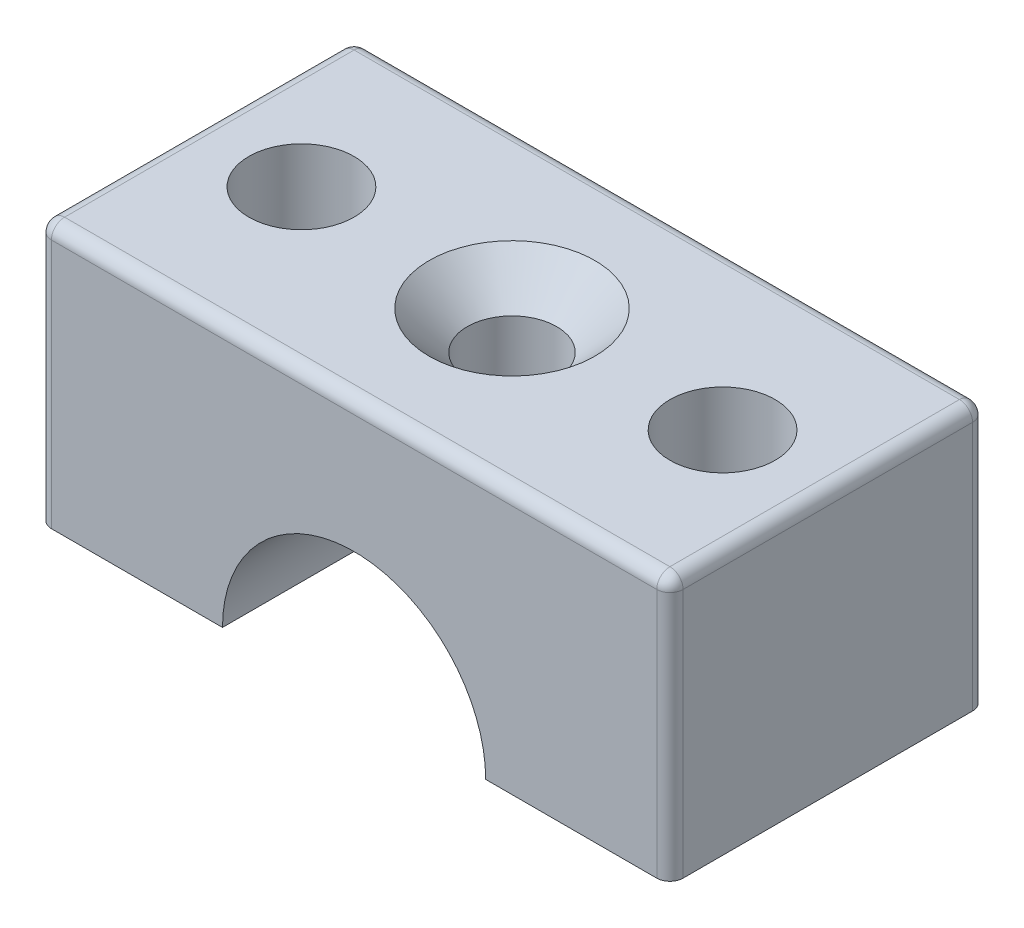
ISO-10303-21;
HEADER;
FILE_DESCRIPTION(('STEP AP214'),'2;1');
FILE_NAME('part.step','',(''),(''),'','','');
FILE_SCHEMA(('AUTOMOTIVE_DESIGN { 1 0 10303 214 1 1 1 1 }'));
ENDSEC;
DATA;
#1=APPLICATION_CONTEXT('core data for automotive mechanical design processes');
#2=APPLICATION_PROTOCOL_DEFINITION('international standard','automotive_design',2000,#1);
#3=PRODUCT_CONTEXT('',#1,'mechanical');
#4=PRODUCT('Part','Part','',(#3));
#5=PRODUCT_RELATED_PRODUCT_CATEGORY('part','',(#4));
#6=PRODUCT_DEFINITION_FORMATION('','',#4);
#7=PRODUCT_DEFINITION_CONTEXT('part definition',#1,'design');
#8=PRODUCT_DEFINITION('design','',#6,#7);
#9=PRODUCT_DEFINITION_SHAPE('','',#8);
#10=(LENGTH_UNIT() NAMED_UNIT(*) SI_UNIT(.MILLI.,.METRE.));
#11=(NAMED_UNIT(*) PLANE_ANGLE_UNIT() SI_UNIT($,.RADIAN.));
#12=(NAMED_UNIT(*) SI_UNIT($,.STERADIAN.) SOLID_ANGLE_UNIT());
#13=UNCERTAINTY_MEASURE_WITH_UNIT(LENGTH_MEASURE(1.E-05),#10,'distance_accuracy_value','');
#14=(GEOMETRIC_REPRESENTATION_CONTEXT(3) GLOBAL_UNCERTAINTY_ASSIGNED_CONTEXT((#13)) GLOBAL_UNIT_ASSIGNED_CONTEXT((#10,
#11,#12)) REPRESENTATION_CONTEXT('',''));
#15=CARTESIAN_POINT('',(0.,0.,0.));
#16=DIRECTION('',(0.,0.,1.));
#17=DIRECTION('',(1.,0.,0.));
#18=AXIS2_PLACEMENT_3D('',#15,#16,#17);
#19=CARTESIAN_POINT('',(0.,0.,12.));
#20=DIRECTION('',(1.,0.,0.));
#21=DIRECTION('',(0.,0.,-1.));
#22=AXIS2_PLACEMENT_3D('',#19,#20,#21);
#23=PLANE('',#22);
#24=DIRECTION('',(0.,0.,-1.));
#25=VECTOR('',#24,1.);
#26=CARTESIAN_POINT('',(0.,9.5,12.));
#27=LINE('',#26,#25);
#28=CARTESIAN_POINT('',(0.,9.5,11.5));
#29=VERTEX_POINT('',#28);
#30=CARTESIAN_POINT('',(0.,9.5,0.5));
#31=VERTEX_POINT('',#30);
#32=EDGE_CURVE('E520',#29,#31,#27,.T.);
#33=ORIENTED_EDGE('',*,*,#32,.T.);
#34=DIRECTION('',(0.,-1.,0.));
#35=VECTOR('',#34,1.);
#36=CARTESIAN_POINT('',(0.,0.,0.5));
#37=LINE('',#36,#35);
#38=CARTESIAN_POINT('',(0.,0.,0.5));
#39=VERTEX_POINT('',#38);
#40=EDGE_CURVE('E523',#31,#39,#37,.T.);
#41=ORIENTED_EDGE('',*,*,#40,.T.);
#42=DIRECTION('',(0.,0.,-1.));
#43=VECTOR('',#42,1.);
#44=CARTESIAN_POINT('',(0.,0.,12.));
#45=LINE('',#44,#43);
#46=CARTESIAN_POINT('',(0.,0.,11.5));
#47=VERTEX_POINT('',#46);
#48=EDGE_CURVE('E146',#47,#39,#45,.T.);
#49=ORIENTED_EDGE('',*,*,#48,.F.);
#50=DIRECTION('',(0.,-1.,0.));
#51=VECTOR('',#50,1.);
#52=CARTESIAN_POINT('',(0.,10.,11.5));
#53=LINE('',#52,#51);
#54=EDGE_CURVE('E168',#47,#29,#53,.F.);
#55=ORIENTED_EDGE('',*,*,#54,.T.);
#56=EDGE_LOOP('',(#33,#41,#49,#55));
#57=FACE_BOUND('',#56,.T.);
#58=ADVANCED_FACE('F41',(#57),#23,.F.);
#59=CARTESIAN_POINT('',(0.,0.,12.));
#60=DIRECTION('',(0.,1.,0.));
#61=DIRECTION('',(0.,0.,1.));
#62=AXIS2_PLACEMENT_3D('',#59,#60,#61);
#63=PLANE('',#62);
#64=CARTESIAN_POINT('',(4.,0.,6.));
#65=DIRECTION('',(0.,1.,0.));
#66=DIRECTION('',(0.,0.,1.));
#67=AXIS2_PLACEMENT_3D('',#64,#65,#66);
#68=CIRCLE('',#67,2.);
#69=CARTESIAN_POINT('',(4.,0.,8.));
#70=VERTEX_POINT('',#69);
#71=EDGE_CURVE('E160',#70,#70,#68,.T.);
#72=ORIENTED_EDGE('',*,*,#71,.T.);
#73=EDGE_LOOP('',(#72));
#74=FACE_BOUND('',#73,.T.);
#75=ORIENTED_EDGE('',*,*,#48,.T.);
#76=CARTESIAN_POINT('',(0.5,0.,0.5));
#77=DIRECTION('',(0.,1.,0.));
#78=DIRECTION('',(0.,0.,1.));
#79=AXIS2_PLACEMENT_3D('',#76,#77,#78);
#80=CIRCLE('',#79,0.5);
#81=CARTESIAN_POINT('',(0.5,0.,0.));
#82=VERTEX_POINT('',#81);
#83=EDGE_CURVE('E528',#39,#82,#80,.F.);
#84=ORIENTED_EDGE('',*,*,#83,.T.);
#85=DIRECTION('',(1.,0.,0.));
#86=VECTOR('',#85,1.);
#87=CARTESIAN_POINT('',(0.,0.,0.));
#88=LINE('',#87,#86);
#89=CARTESIAN_POINT('',(7.,0.,0.));
#90=VERTEX_POINT('',#89);
#91=EDGE_CURVE('E143',#82,#90,#88,.T.);
#92=ORIENTED_EDGE('',*,*,#91,.T.);
#93=DIRECTION('',(0.,0.,-1.));
#94=VECTOR('',#93,1.);
#95=CARTESIAN_POINT('',(7.,0.,12.));
#96=LINE('',#95,#94);
#97=CARTESIAN_POINT('',(7.,0.,12.));
#98=VERTEX_POINT('',#97);
#99=EDGE_CURVE('E139',#98,#90,#96,.T.);
#100=ORIENTED_EDGE('',*,*,#99,.F.);
#101=DIRECTION('',(1.,0.,0.));
#102=VECTOR('',#101,1.);
#103=CARTESIAN_POINT('',(0.,0.,12.));
#104=LINE('',#103,#102);
#105=CARTESIAN_POINT('',(0.5,0.,12.));
#106=VERTEX_POINT('',#105);
#107=EDGE_CURVE('E128',#106,#98,#104,.T.);
#108=ORIENTED_EDGE('',*,*,#107,.F.);
#109=CARTESIAN_POINT('',(0.5,0.,11.5));
#110=DIRECTION('',(0.,1.,0.));
#111=DIRECTION('',(0.,0.,1.));
#112=AXIS2_PLACEMENT_3D('',#109,#110,#111);
#113=CIRCLE('',#112,0.5);
#114=EDGE_CURVE('E524',#106,#47,#113,.F.);
#115=ORIENTED_EDGE('',*,*,#114,.T.);
#116=EDGE_LOOP('',(#75,#84,#92,#100,#108,#115));
#117=FACE_BOUND('',#116,.T.);
#118=ADVANCED_FACE('F141',(#74,#117),#63,.F.);
#119=CARTESIAN_POINT('',(12.,0.,12.));
#120=DIRECTION('',(0.,0.,-1.));
#121=DIRECTION('',(-1.,0.,0.));
#122=AXIS2_PLACEMENT_3D('',#119,#120,#121);
#123=CYLINDRICAL_SURFACE('',#122,5.);
#124=CARTESIAN_POINT('',(12.,5.,7.7));
#125=CARTESIAN_POINT('',(12.0926517266343,5.00000053974522,7.70000081321365));
#126=CARTESIAN_POINT('',(12.1852978409041,4.99740114751481,7.69240106681847));
#127=CARTESIAN_POINT('',(12.3678548794934,4.98728823519212,7.66230042037197));
#128=CARTESIAN_POINT('',(12.4577656279797,4.97977439988791,7.63979856449953));
#129=CARTESIAN_POINT('',(12.6321937588931,4.96064754933191,7.58075861520221));
#130=CARTESIAN_POINT('',(12.716720087292,4.94904155447657,7.5442445513148));
#131=CARTESIAN_POINT('',(12.878448155995,4.922910546311,7.45832739247377));
#132=CARTESIAN_POINT('',(12.955648357167,4.90838492161116,7.40892159725996));
#133=CARTESIAN_POINT('',(13.1033010477789,4.87735641140681,7.29676427675925));
#134=CARTESIAN_POINT('',(13.1734547524874,4.86080478902838,7.23363297684879));
#135=CARTESIAN_POINT('',(13.3024093352034,4.8278533752106,7.09662388036726));
#136=CARTESIAN_POINT('',(13.361207576024,4.81145361988067,7.02274359442562));
#137=CARTESIAN_POINT('',(13.4675167631047,4.78012194528327,6.86360908824248));
#138=CARTESIAN_POINT('',(13.5146342174542,4.765249144477,6.77807922820964));
#139=CARTESIAN_POINT('',(13.5936874207223,4.73939901308068,6.59972213574938));
#140=CARTESIAN_POINT('',(13.6256280170797,4.72842043897173,6.50689724438519));
#141=CARTESIAN_POINT('',(13.6722908634224,4.71211616556768,6.31999018690957));
#142=CARTESIAN_POINT('',(13.6875747086168,4.70660669024342,6.22606474406315));
#143=CARTESIAN_POINT('',(13.7022460198752,4.7013216377617,6.03683339733164));
#144=CARTESIAN_POINT('',(13.7016386356348,4.70154420308466,5.94152795065505));
#145=CARTESIAN_POINT('',(13.6849797361052,4.70753742686056,5.75708202168226));
#146=CARTESIAN_POINT('',(13.6696677681716,4.71304240304261,5.66786459850567));
#147=CARTESIAN_POINT('',(13.6252432661147,4.72854439660695,5.49334980503203));
#148=CARTESIAN_POINT('',(13.5961290169208,4.73854197223132,5.4080529233465));
#149=CARTESIAN_POINT('',(13.5244546121525,4.76208737138908,5.24214705150006));
#150=CARTESIAN_POINT('',(13.4816796029296,4.77569129011484,5.16163918857295));
#151=CARTESIAN_POINT('',(13.384047095996,4.80489379036339,5.00871317045461));
#152=CARTESIAN_POINT('',(13.3291859965614,4.82049296590171,4.93629743648055));
#153=CARTESIAN_POINT('',(13.2054124968599,4.85296665663681,4.79746459588537));
#154=CARTESIAN_POINT('',(13.1358975801416,4.86986436164672,4.73158894258276));
#155=CARTESIAN_POINT('',(12.986600707967,4.90229000755873,4.61228586890227));
#156=CARTESIAN_POINT('',(12.906817687911,4.91781780614684,4.55885974091088));
#157=CARTESIAN_POINT('',(12.7380657470136,4.9459724942496,4.4655126880099));
#158=CARTESIAN_POINT('',(12.6490077787487,4.95856661266288,4.42574217528973));
#159=CARTESIAN_POINT('',(12.4649342139772,4.9791963776137,4.36191705156505));
#160=CARTESIAN_POINT('',(12.369920787971,4.98723367430583,4.33785675096714));
#161=CARTESIAN_POINT('',(12.1812131227794,4.99756827535267,4.3071066608089));
#162=CARTESIAN_POINT('',(12.0876511089461,5.00010703864747,4.29968563340741));
#163=CARTESIAN_POINT('',(11.9005967062911,4.999886055746,4.30033467733404));
#164=CARTESIAN_POINT('',(11.8071043080928,4.99712724502308,4.30840201364582));
#165=CARTESIAN_POINT('',(11.6258051776332,4.98678058356771,4.33922329358536));
#166=CARTESIAN_POINT('',(11.537912003212,4.97934191750242,4.36152381830612));
#167=CARTESIAN_POINT('',(11.3671537141052,4.96053327885743,4.41960698313039));
#168=CARTESIAN_POINT('',(11.2842892466714,4.94916280146497,4.45539135450362));
#169=CARTESIAN_POINT('',(11.1234565825462,4.92325998189486,4.54048938151176));
#170=CARTESIAN_POINT('',(11.0456797954244,4.90865088470727,4.59014075625401));
#171=CARTESIAN_POINT('',(10.8993267737938,4.87792165146137,4.70116915391499));
#172=CARTESIAN_POINT('',(10.8307534599849,4.86180103847107,4.7625498842082));
#173=CARTESIAN_POINT('',(10.7013705948484,4.82889544529532,4.8987310265994));
#174=CARTESIAN_POINT('',(10.6410826846293,4.81211516728289,4.9740293951596));
#175=CARTESIAN_POINT('',(10.5339279165041,4.78056093987685,5.13403115119974));
#176=CARTESIAN_POINT('',(10.4870613026618,4.7657870269712,5.21873470967248));
#177=CARTESIAN_POINT('',(10.4082653218455,4.74005345178856,5.39526267211923));
#178=CARTESIAN_POINT('',(10.3763169844435,4.7290889499445,5.48707785851399));
#179=CARTESIAN_POINT('',(10.328489483821,4.71239925775974,5.67524702691392));
#180=CARTESIAN_POINT('',(10.3126026907187,4.70667157984011,5.77159883105463));
#181=CARTESIAN_POINT('',(10.2979588391211,4.70139450040209,5.96057010806908));
#182=CARTESIAN_POINT('',(10.2983324626772,4.70153155060048,6.05311418025759));
#183=CARTESIAN_POINT('',(10.3140458476191,4.70718883464077,6.23674662705618));
#184=CARTESIAN_POINT('',(10.3293846480734,4.7127087228444,6.32783509475061));
#185=CARTESIAN_POINT('',(10.3739673219321,4.72827175700855,6.50409946796409));
#186=CARTESIAN_POINT('',(10.4029186617998,4.73821951873993,6.58935845546512));
#187=CARTESIAN_POINT('',(10.4736648290922,4.76147886133544,6.75387246759847));
#188=CARTESIAN_POINT('',(10.5154625780709,4.77479120725701,6.83312612137071));
#189=CARTESIAN_POINT('',(10.6129117059045,4.80402761878284,6.98725348194453));
#190=CARTESIAN_POINT('',(10.6691026045107,4.82004235884589,7.06176874978214));
#191=CARTESIAN_POINT('',(10.7928429759383,4.85251054927177,7.20059279640688));
#192=CARTESIAN_POINT('',(10.8603957206662,4.86896412485572,7.26489862475042));
#193=CARTESIAN_POINT('',(11.008279364831,4.90126937318732,7.38415185803213));
#194=CARTESIAN_POINT('',(11.0890218209511,4.91706838275857,7.43860502120632));
#195=CARTESIAN_POINT('',(11.2590409206315,4.94554300070808,7.53311220904018));
#196=CARTESIAN_POINT('',(11.3483157853147,4.9582192581695,7.57316922682254));
#197=CARTESIAN_POINT('',(11.5300057835851,4.97867393220817,7.63647981863848));
#198=CARTESIAN_POINT('',(11.6222346502078,4.98659347429703,7.66022093956854));
#199=CARTESIAN_POINT('',(11.8096449243024,4.99725544231626,7.69197821709496));
#200=CARTESIAN_POINT('',(11.9048254232354,4.99999944555784,7.69999916464303));
#201=CARTESIAN_POINT('',(12.,5.,7.7));
#202=B_SPLINE_CURVE_WITH_KNOTS('',3,(#124,#125,#126,#127,#128,#129,#130,#131,#132,#133,#134,
#135,#136,#137,#138,#139,#140,#141,#142,#143,#144,#145,#146,#147,#148,#149,#150,#151,#152,#153,
#154,#155,#156,#157,#158,#159,#160,#161,#162,#163,#164,#165,#166,#167,#168,#169,#170,#171,#172,
#173,#174,#175,#176,#177,#178,#179,#180,#181,#182,#183,#184,#185,#186,#187,#188,#189,#190,#191,
#192,#193,#194,#195,#196,#197,#198,#199,#200,#201),.UNSPECIFIED.,.T.,.F.,(4,2,2,2,2,2,2,2,2,2,2,
2,2,2,2,2,2,2,2,2,2,2,2,2,2,2,2,2,2,2,2,2,2,2,2,2,2,2,4),(0.,0.277604812454209,
0.555227432202289,0.832376069231255,1.10958280357735,1.39575019897966,1.68198397403887,
1.97684250714305,2.27160679998526,2.55609209992366,2.84048521098944,3.11128561339879,
3.38211967427179,3.65744251297918,3.9328475107206,4.22325088328035,4.51368438922706,
4.8072213650612,5.10065197481199,5.38091125993655,5.66112105996141,5.93282188831577,
6.20455761381789,6.48359542716989,6.76272158415867,7.05506992492986,7.34742358166511,
7.63940445541065,7.93124656119219,8.20750633581867,8.48374837265225,8.75430780753003,
9.02492881911903,9.30774780974608,9.59064838453032,9.88519518621559,10.179680712788,
10.4649314831929,10.7500953057456),.UNSPECIFIED.);
#203=CARTESIAN_POINT('',(12.,5.,7.7));
#204=VERTEX_POINT('',#203);
#205=EDGE_CURVE('E169',#204,#204,#202,.T.);
#206=ORIENTED_EDGE('',*,*,#205,.T.);
#207=EDGE_LOOP('',(#206));
#208=FACE_BOUND('',#207,.T.);
#209=CARTESIAN_POINT('',(12.,0.,0.));
#210=DIRECTION('',(0.,0.,-1.));
#211=DIRECTION('',(1.,0.,0.));
#212=AXIS2_PLACEMENT_3D('',#209,#210,#211);
#213=CIRCLE('',#212,5.);
#214=CARTESIAN_POINT('',(17.,0.,0.));
#215=VERTEX_POINT('',#214);
#216=EDGE_CURVE('E159',#90,#215,#213,.T.);
#217=ORIENTED_EDGE('',*,*,#216,.T.);
#218=DIRECTION('',(0.,0.,-1.));
#219=VECTOR('',#218,1.);
#220=CARTESIAN_POINT('',(17.,0.,12.));
#221=LINE('',#220,#219);
#222=CARTESIAN_POINT('',(17.,0.,12.));
#223=VERTEX_POINT('',#222);
#224=EDGE_CURVE('E147',#223,#215,#221,.T.);
#225=ORIENTED_EDGE('',*,*,#224,.F.);
#226=CARTESIAN_POINT('',(12.,0.,12.));
#227=DIRECTION('',(0.,0.,-1.));
#228=DIRECTION('',(1.,0.,0.));
#229=AXIS2_PLACEMENT_3D('',#226,#227,#228);
#230=CIRCLE('',#229,5.);
#231=EDGE_CURVE('E132',#98,#223,#230,.T.);
#232=ORIENTED_EDGE('',*,*,#231,.F.);
#233=ORIENTED_EDGE('',*,*,#99,.T.);
#234=EDGE_LOOP('',(#217,#225,#232,#233));
#235=FACE_BOUND('',#234,.T.);
#236=ADVANCED_FACE('F149',(#208,#235),#123,.F.);
#237=CARTESIAN_POINT('',(17.,0.,12.));
#238=DIRECTION('',(0.,1.,0.));
#239=DIRECTION('',(0.,0.,1.));
#240=AXIS2_PLACEMENT_3D('',#237,#238,#239);
#241=PLANE('',#240);
#242=CARTESIAN_POINT('',(20.,0.,6.));
#243=DIRECTION('',(0.,1.,0.));
#244=DIRECTION('',(0.,0.,1.));
#245=AXIS2_PLACEMENT_3D('',#242,#243,#244);
#246=CIRCLE('',#245,2.);
#247=CARTESIAN_POINT('',(20.,0.,8.));
#248=VERTEX_POINT('',#247);
#249=EDGE_CURVE('E331',#248,#248,#246,.T.);
#250=ORIENTED_EDGE('',*,*,#249,.T.);
#251=EDGE_LOOP('',(#250));
#252=FACE_BOUND('',#251,.T.);
#253=DIRECTION('',(1.,0.,0.));
#254=VECTOR('',#253,1.);
#255=CARTESIAN_POINT('',(17.,0.,0.));
#256=LINE('',#255,#254);
#257=CARTESIAN_POINT('',(23.5,0.,0.));
#258=VERTEX_POINT('',#257);
#259=EDGE_CURVE('E136',#215,#258,#256,.T.);
#260=ORIENTED_EDGE('',*,*,#259,.T.);
#261=CARTESIAN_POINT('',(23.5,0.,0.5));
#262=DIRECTION('',(0.,1.,0.));
#263=DIRECTION('',(0.,0.,1.));
#264=AXIS2_PLACEMENT_3D('',#261,#262,#263);
#265=CIRCLE('',#264,0.5);
#266=CARTESIAN_POINT('',(24.,0.,0.5));
#267=VERTEX_POINT('',#266);
#268=EDGE_CURVE('E289',#258,#267,#265,.F.);
#269=ORIENTED_EDGE('',*,*,#268,.T.);
#270=DIRECTION('',(0.,0.,-1.));
#271=VECTOR('',#270,1.);
#272=CARTESIAN_POINT('',(24.,0.,12.));
#273=LINE('',#272,#271);
#274=CARTESIAN_POINT('',(24.,0.,11.5));
#275=VERTEX_POINT('',#274);
#276=EDGE_CURVE('E154',#275,#267,#273,.T.);
#277=ORIENTED_EDGE('',*,*,#276,.F.);
#278=CARTESIAN_POINT('',(23.5,0.,11.5));
#279=DIRECTION('',(0.,1.,0.));
#280=DIRECTION('',(0.,0.,1.));
#281=AXIS2_PLACEMENT_3D('',#278,#279,#280);
#282=CIRCLE('',#281,0.5);
#283=CARTESIAN_POINT('',(23.5,0.,12.));
#284=VERTEX_POINT('',#283);
#285=EDGE_CURVE('E292',#275,#284,#282,.F.);
#286=ORIENTED_EDGE('',*,*,#285,.T.);
#287=DIRECTION('',(1.,0.,0.));
#288=VECTOR('',#287,1.);
#289=CARTESIAN_POINT('',(17.,0.,12.));
#290=LINE('',#289,#288);
#291=EDGE_CURVE('E152',#223,#284,#290,.T.);
#292=ORIENTED_EDGE('',*,*,#291,.F.);
#293=ORIENTED_EDGE('',*,*,#224,.T.);
#294=EDGE_LOOP('',(#260,#269,#277,#286,#292,#293));
#295=FACE_BOUND('',#294,.T.);
#296=ADVANCED_FACE('F210',(#252,#295),#241,.F.);
#297=CARTESIAN_POINT('',(24.,0.,12.));
#298=DIRECTION('',(-1.,0.,0.));
#299=DIRECTION('',(0.,0.,1.));
#300=AXIS2_PLACEMENT_3D('',#297,#298,#299);
#301=PLANE('',#300);
#302=ORIENTED_EDGE('',*,*,#276,.T.);
#303=DIRECTION('',(0.,1.,0.));
#304=VECTOR('',#303,1.);
#305=CARTESIAN_POINT('',(24.,0.,0.5));
#306=LINE('',#305,#304);
#307=CARTESIAN_POINT('',(24.,9.5,0.5));
#308=VERTEX_POINT('',#307);
#309=EDGE_CURVE('E504',#267,#308,#306,.T.);
#310=ORIENTED_EDGE('',*,*,#309,.T.);
#311=DIRECTION('',(0.,0.,-1.));
#312=VECTOR('',#311,1.);
#313=CARTESIAN_POINT('',(24.,9.5,12.));
#314=LINE('',#313,#312);
#315=CARTESIAN_POINT('',(24.,9.5,11.5));
#316=VERTEX_POINT('',#315);
#317=EDGE_CURVE('E486',#308,#316,#314,.F.);
#318=ORIENTED_EDGE('',*,*,#317,.T.);
#319=DIRECTION('',(0.,1.,0.));
#320=VECTOR('',#319,1.);
#321=CARTESIAN_POINT('',(24.,0.,11.5));
#322=LINE('',#321,#320);
#323=EDGE_CURVE('E502',#316,#275,#322,.F.);
#324=ORIENTED_EDGE('',*,*,#323,.T.);
#325=EDGE_LOOP('',(#302,#310,#318,#324));
#326=FACE_BOUND('',#325,.T.);
#327=ADVANCED_FACE('F207',(#326),#301,.F.);
#328=CARTESIAN_POINT('',(0.,10.,12.));
#329=DIRECTION('',(0.,-1.,0.));
#330=DIRECTION('',(0.,0.,-1.));
#331=AXIS2_PLACEMENT_3D('',#328,#329,#330);
#332=PLANE('',#331);
#333=DIRECTION('',(0.,0.,-1.));
#334=VECTOR('',#333,1.);
#335=CARTESIAN_POINT('',(23.5,10.,12.));
#336=LINE('',#335,#334);
#337=CARTESIAN_POINT('',(23.5,10.,11.5));
#338=VERTEX_POINT('',#337);
#339=CARTESIAN_POINT('',(23.5,10.,0.5));
#340=VERTEX_POINT('',#339);
#341=EDGE_CURVE('E488',#338,#340,#336,.T.);
#342=ORIENTED_EDGE('',*,*,#341,.T.);
#343=DIRECTION('',(-1.,0.,0.));
#344=VECTOR('',#343,1.);
#345=CARTESIAN_POINT('',(0.,10.,0.5));
#346=LINE('',#345,#344);
#347=CARTESIAN_POINT('',(0.5,10.,0.5));
#348=VERTEX_POINT('',#347);
#349=EDGE_CURVE('E494',#340,#348,#346,.T.);
#350=ORIENTED_EDGE('',*,*,#349,.T.);
#351=DIRECTION('',(0.,0.,-1.));
#352=VECTOR('',#351,1.);
#353=CARTESIAN_POINT('',(0.5,10.,12.));
#354=LINE('',#353,#352);
#355=CARTESIAN_POINT('',(0.5,10.,11.5));
#356=VERTEX_POINT('',#355);
#357=EDGE_CURVE('E491',#348,#356,#354,.F.);
#358=ORIENTED_EDGE('',*,*,#357,.T.);
#359=DIRECTION('',(-1.,0.,0.));
#360=VECTOR('',#359,1.);
#361=CARTESIAN_POINT('',(24.,10.,11.5));
#362=LINE('',#361,#360);
#363=EDGE_CURVE('E492',#356,#338,#362,.F.);
#364=ORIENTED_EDGE('',*,*,#363,.T.);
#365=EDGE_LOOP('',(#342,#350,#358,#364));
#366=FACE_BOUND('',#365,.T.);
#367=CARTESIAN_POINT('',(12.,10.,6.));
#368=DIRECTION('',(0.,1.,0.));
#369=DIRECTION('',(0.,0.,1.));
#370=AXIS2_PLACEMENT_3D('',#367,#368,#369);
#371=CIRCLE('',#370,3.15);
#372=CARTESIAN_POINT('',(12.,10.,9.15));
#373=VERTEX_POINT('',#372);
#374=EDGE_CURVE('E318',#373,#373,#371,.T.);
#375=ORIENTED_EDGE('',*,*,#374,.F.);
#376=EDGE_LOOP('',(#375));
#377=FACE_BOUND('',#376,.T.);
#378=CARTESIAN_POINT('',(4.,10.,6.));
#379=DIRECTION('',(0.,1.,0.));
#380=DIRECTION('',(0.,0.,1.));
#381=AXIS2_PLACEMENT_3D('',#378,#379,#380);
#382=CIRCLE('',#381,2.);
#383=CARTESIAN_POINT('',(4.,10.,8.));
#384=VERTEX_POINT('',#383);
#385=EDGE_CURVE('E328',#384,#384,#382,.T.);
#386=ORIENTED_EDGE('',*,*,#385,.F.);
#387=EDGE_LOOP('',(#386));
#388=FACE_BOUND('',#387,.T.);
#389=CARTESIAN_POINT('',(20.,10.,6.));
#390=DIRECTION('',(0.,1.,0.));
#391=DIRECTION('',(0.,0.,1.));
#392=AXIS2_PLACEMENT_3D('',#389,#390,#391);
#393=CIRCLE('',#392,2.);
#394=CARTESIAN_POINT('',(20.,10.,8.));
#395=VERTEX_POINT('',#394);
#396=EDGE_CURVE('E177',#395,#395,#393,.T.);
#397=ORIENTED_EDGE('',*,*,#396,.F.);
#398=EDGE_LOOP('',(#397));
#399=FACE_BOUND('',#398,.T.);
#400=ADVANCED_FACE('F201',(#366,#377,#388,#399),#332,.F.);
#401=CARTESIAN_POINT('',(12.,0.,12.));
#402=DIRECTION('',(0.,0.,1.));
#403=DIRECTION('',(1.,0.,0.));
#404=AXIS2_PLACEMENT_3D('',#401,#402,#403);
#405=PLANE('',#404);
#406=ORIENTED_EDGE('',*,*,#291,.T.);
#407=DIRECTION('',(0.,1.,0.));
#408=VECTOR('',#407,1.);
#409=CARTESIAN_POINT('',(23.5,10.,12.));
#410=LINE('',#409,#408);
#411=CARTESIAN_POINT('',(23.5,9.5,12.));
#412=VERTEX_POINT('',#411);
#413=EDGE_CURVE('E11',#284,#412,#410,.T.);
#414=ORIENTED_EDGE('',*,*,#413,.T.);
#415=DIRECTION('',(-1.,0.,0.));
#416=VECTOR('',#415,1.);
#417=CARTESIAN_POINT('',(0.,9.5,12.));
#418=LINE('',#417,#416);
#419=CARTESIAN_POINT('',(0.5,9.5,12.));
#420=VERTEX_POINT('',#419);
#421=EDGE_CURVE('E57',#412,#420,#418,.T.);
#422=ORIENTED_EDGE('',*,*,#421,.T.);
#423=DIRECTION('',(0.,-1.,0.));
#424=VECTOR('',#423,1.);
#425=CARTESIAN_POINT('',(0.5,0.,12.));
#426=LINE('',#425,#424);
#427=EDGE_CURVE('E50',#420,#106,#426,.T.);
#428=ORIENTED_EDGE('',*,*,#427,.T.);
#429=ORIENTED_EDGE('',*,*,#107,.T.);
#430=ORIENTED_EDGE('',*,*,#231,.T.);
#431=EDGE_LOOP('',(#406,#414,#422,#428,#429,#430));
#432=FACE_BOUND('',#431,.T.);
#433=ADVANCED_FACE('F130',(#432),#405,.T.);
#434=CARTESIAN_POINT('',(12.,0.,0.));
#435=DIRECTION('',(0.,0.,1.));
#436=DIRECTION('',(1.,0.,0.));
#437=AXIS2_PLACEMENT_3D('',#434,#435,#436);
#438=PLANE('',#437);
#439=ORIENTED_EDGE('',*,*,#91,.F.);
#440=DIRECTION('',(0.,-1.,0.));
#441=VECTOR('',#440,1.);
#442=CARTESIAN_POINT('',(0.5,0.,0.));
#443=LINE('',#442,#441);
#444=CARTESIAN_POINT('',(0.5,9.5,0.));
#445=VERTEX_POINT('',#444);
#446=EDGE_CURVE('E496',#82,#445,#443,.F.);
#447=ORIENTED_EDGE('',*,*,#446,.T.);
#448=DIRECTION('',(-1.,0.,0.));
#449=VECTOR('',#448,1.);
#450=CARTESIAN_POINT('',(12.,9.5,0.));
#451=LINE('',#450,#449);
#452=CARTESIAN_POINT('',(23.5,9.5,0.));
#453=VERTEX_POINT('',#452);
#454=EDGE_CURVE('E531',#445,#453,#451,.F.);
#455=ORIENTED_EDGE('',*,*,#454,.T.);
#456=DIRECTION('',(0.,1.,0.));
#457=VECTOR('',#456,1.);
#458=CARTESIAN_POINT('',(23.5,0.,0.));
#459=LINE('',#458,#457);
#460=EDGE_CURVE('E511',#453,#258,#459,.F.);
#461=ORIENTED_EDGE('',*,*,#460,.T.);
#462=ORIENTED_EDGE('',*,*,#259,.F.);
#463=ORIENTED_EDGE('',*,*,#216,.F.);
#464=EDGE_LOOP('',(#439,#447,#455,#461,#462,#463));
#465=FACE_BOUND('',#464,.T.);
#466=ADVANCED_FACE('F197',(#465),#438,.F.);
#467=CARTESIAN_POINT('',(20.,0.,6.));
#468=DIRECTION('',(0.,1.,0.));
#469=DIRECTION('',(0.,0.,1.));
#470=AXIS2_PLACEMENT_3D('',#467,#468,#469);
#471=CYLINDRICAL_SURFACE('',#470,2.);
#472=ORIENTED_EDGE('',*,*,#249,.F.);
#473=EDGE_LOOP('',(#472));
#474=FACE_BOUND('',#473,.T.);
#475=ORIENTED_EDGE('',*,*,#396,.T.);
#476=EDGE_LOOP('',(#475));
#477=FACE_BOUND('',#476,.T.);
#478=ADVANCED_FACE('F193',(#474,#477),#471,.F.);
#479=CARTESIAN_POINT('',(4.,0.,6.));
#480=DIRECTION('',(0.,1.,0.));
#481=DIRECTION('',(0.,0.,1.));
#482=AXIS2_PLACEMENT_3D('',#479,#480,#481);
#483=CYLINDRICAL_SURFACE('',#482,2.);
#484=ORIENTED_EDGE('',*,*,#71,.F.);
#485=EDGE_LOOP('',(#484));
#486=FACE_BOUND('',#485,.T.);
#487=ORIENTED_EDGE('',*,*,#385,.T.);
#488=EDGE_LOOP('',(#487));
#489=FACE_BOUND('',#488,.T.);
#490=ADVANCED_FACE('F189',(#486,#489),#483,.F.);
#491=CARTESIAN_POINT('',(12.,10.,6.));
#492=DIRECTION('',(0.,1.,0.));
#493=DIRECTION('',(0.,0.,1.));
#494=AXIS2_PLACEMENT_3D('',#491,#492,#493);
#495=CYLINDRICAL_SURFACE('',#494,1.7);
#496=CARTESIAN_POINT('',(12.,8.55,6.));
#497=DIRECTION('',(0.,1.,0.));
#498=DIRECTION('',(0.,0.,1.));
#499=AXIS2_PLACEMENT_3D('',#496,#497,#498);
#500=CIRCLE('',#499,1.7);
#501=CARTESIAN_POINT('',(12.,8.55,7.7));
#502=VERTEX_POINT('',#501);
#503=EDGE_CURVE('E178',#502,#502,#500,.T.);
#504=ORIENTED_EDGE('',*,*,#503,.T.);
#505=EDGE_LOOP('',(#504));
#506=FACE_BOUND('',#505,.T.);
#507=ORIENTED_EDGE('',*,*,#205,.F.);
#508=EDGE_LOOP('',(#507));
#509=FACE_BOUND('',#508,.T.);
#510=ADVANCED_FACE('F183',(#506,#509),#495,.F.);
#511=CARTESIAN_POINT('',(12.,10.,6.));
#512=DIRECTION('',(0.,1.,0.));
#513=DIRECTION('',(0.,0.,1.));
#514=AXIS2_PLACEMENT_3D('',#511,#512,#513);
#515=CONICAL_SURFACE('',#514,3.15,0.785398163397448);
#516=ORIENTED_EDGE('',*,*,#503,.F.);
#517=EDGE_LOOP('',(#516));
#518=FACE_BOUND('',#517,.T.);
#519=ORIENTED_EDGE('',*,*,#374,.T.);
#520=EDGE_LOOP('',(#519));
#521=FACE_BOUND('',#520,.T.);
#522=ADVANCED_FACE('F188',(#518,#521),#515,.F.);
#523=CARTESIAN_POINT('',(23.5,0.,11.5));
#524=DIRECTION('',(0.,-1.,0.));
#525=DIRECTION('',(0.,0.,-1.));
#526=AXIS2_PLACEMENT_3D('',#523,#524,#525);
#527=CYLINDRICAL_SURFACE('',#526,0.5);
#528=CARTESIAN_POINT('',(23.5,9.5,11.5));
#529=DIRECTION('',(0.,1.,0.));
#530=DIRECTION('',(0.,0.,1.));
#531=AXIS2_PLACEMENT_3D('',#528,#529,#530);
#532=CIRCLE('',#531,0.5);
#533=EDGE_CURVE('E45',#412,#316,#532,.T.);
#534=ORIENTED_EDGE('',*,*,#533,.F.);
#535=ORIENTED_EDGE('',*,*,#413,.F.);
#536=ORIENTED_EDGE('',*,*,#285,.F.);
#537=ORIENTED_EDGE('',*,*,#323,.F.);
#538=EDGE_LOOP('',(#534,#535,#536,#537));
#539=FACE_BOUND('',#538,.T.);
#540=ADVANCED_FACE('F43',(#539),#527,.T.);
#541=CARTESIAN_POINT('',(23.5,9.5,11.5));
#542=DIRECTION('',(1.,0.,0.));
#543=DIRECTION('',(0.,0.,-1.));
#544=AXIS2_PLACEMENT_3D('',#541,#542,#543);
#545=SPHERICAL_SURFACE('',#544,0.5);
#546=CARTESIAN_POINT('',(23.5,9.5,11.5));
#547=DIRECTION('',(1.,0.,0.));
#548=DIRECTION('',(0.,0.,-1.));
#549=AXIS2_PLACEMENT_3D('',#546,#547,#548);
#550=CIRCLE('',#549,0.5);
#551=EDGE_CURVE('E278',#412,#338,#550,.F.);
#552=ORIENTED_EDGE('',*,*,#551,.F.);
#553=ORIENTED_EDGE('',*,*,#533,.T.);
#554=CARTESIAN_POINT('',(23.5,9.5,11.5));
#555=DIRECTION('',(0.,0.,1.));
#556=DIRECTION('',(1.,0.,0.));
#557=AXIS2_PLACEMENT_3D('',#554,#555,#556);
#558=CIRCLE('',#557,0.5);
#559=EDGE_CURVE('E280',#338,#316,#558,.F.);
#560=ORIENTED_EDGE('',*,*,#559,.F.);
#561=EDGE_LOOP('',(#552,#553,#560));
#562=FACE_BOUND('',#561,.T.);
#563=ADVANCED_FACE('F266',(#562),#545,.T.);
#564=CARTESIAN_POINT('',(23.5,0.,0.5));
#565=DIRECTION('',(0.,1.,0.));
#566=DIRECTION('',(0.,0.,1.));
#567=AXIS2_PLACEMENT_3D('',#564,#565,#566);
#568=CYLINDRICAL_SURFACE('',#567,0.5);
#569=ORIENTED_EDGE('',*,*,#268,.F.);
#570=ORIENTED_EDGE('',*,*,#460,.F.);
#571=CARTESIAN_POINT('',(23.5,9.5,0.5));
#572=DIRECTION('',(0.,1.,0.));
#573=DIRECTION('',(0.,0.,1.));
#574=AXIS2_PLACEMENT_3D('',#571,#572,#573);
#575=CIRCLE('',#574,0.5);
#576=EDGE_CURVE('E283',#308,#453,#575,.T.);
#577=ORIENTED_EDGE('',*,*,#576,.F.);
#578=ORIENTED_EDGE('',*,*,#309,.F.);
#579=EDGE_LOOP('',(#569,#570,#577,#578));
#580=FACE_BOUND('',#579,.T.);
#581=ADVANCED_FACE('F263',(#580),#568,.T.);
#582=CARTESIAN_POINT('',(23.5,9.5,12.));
#583=DIRECTION('',(0.,0.,-1.));
#584=DIRECTION('',(-1.,0.,0.));
#585=AXIS2_PLACEMENT_3D('',#582,#583,#584);
#586=CYLINDRICAL_SURFACE('',#585,0.5);
#587=ORIENTED_EDGE('',*,*,#559,.T.);
#588=ORIENTED_EDGE('',*,*,#317,.F.);
#589=CARTESIAN_POINT('',(23.5,9.5,0.5));
#590=DIRECTION('',(0.,0.,-1.));
#591=DIRECTION('',(-1.,0.,0.));
#592=AXIS2_PLACEMENT_3D('',#589,#590,#591);
#593=CIRCLE('',#592,0.5);
#594=EDGE_CURVE('E313',#340,#308,#593,.T.);
#595=ORIENTED_EDGE('',*,*,#594,.F.);
#596=ORIENTED_EDGE('',*,*,#341,.F.);
#597=EDGE_LOOP('',(#587,#588,#595,#596));
#598=FACE_BOUND('',#597,.T.);
#599=ADVANCED_FACE('F259',(#598),#586,.T.);
#600=CARTESIAN_POINT('',(12.,9.5,11.5));
#601=DIRECTION('',(1.,0.,0.));
#602=DIRECTION('',(0.,0.,-1.));
#603=AXIS2_PLACEMENT_3D('',#600,#601,#602);
#604=CYLINDRICAL_SURFACE('',#603,0.5);
#605=ORIENTED_EDGE('',*,*,#551,.T.);
#606=ORIENTED_EDGE('',*,*,#363,.F.);
#607=CARTESIAN_POINT('',(0.5,9.5,11.5));
#608=DIRECTION('',(-1.,0.,0.));
#609=DIRECTION('',(0.,-1.,0.));
#610=AXIS2_PLACEMENT_3D('',#607,#608,#609);
#611=CIRCLE('',#610,0.5);
#612=EDGE_CURVE('E287',#420,#356,#611,.T.);
#613=ORIENTED_EDGE('',*,*,#612,.F.);
#614=ORIENTED_EDGE('',*,*,#421,.F.);
#615=EDGE_LOOP('',(#605,#606,#613,#614));
#616=FACE_BOUND('',#615,.T.);
#617=ADVANCED_FACE('F255',(#616),#604,.T.);
#618=CARTESIAN_POINT('',(0.5,0.,11.5));
#619=DIRECTION('',(0.,1.,0.));
#620=DIRECTION('',(0.,0.,1.));
#621=AXIS2_PLACEMENT_3D('',#618,#619,#620);
#622=CYLINDRICAL_SURFACE('',#621,0.5);
#623=ORIENTED_EDGE('',*,*,#114,.F.);
#624=ORIENTED_EDGE('',*,*,#427,.F.);
#625=CARTESIAN_POINT('',(0.5,9.5,11.5));
#626=DIRECTION('',(0.,1.,0.));
#627=DIRECTION('',(0.,0.,1.));
#628=AXIS2_PLACEMENT_3D('',#625,#626,#627);
#629=CIRCLE('',#628,0.5);
#630=EDGE_CURVE('E310',#29,#420,#629,.T.);
#631=ORIENTED_EDGE('',*,*,#630,.F.);
#632=ORIENTED_EDGE('',*,*,#54,.F.);
#633=EDGE_LOOP('',(#623,#624,#631,#632));
#634=FACE_BOUND('',#633,.T.);
#635=ADVANCED_FACE('F251',(#634),#622,.T.);
#636=CARTESIAN_POINT('',(23.5,9.5,0.5));
#637=DIRECTION('',(1.,0.,0.));
#638=DIRECTION('',(0.,0.,-1.));
#639=AXIS2_PLACEMENT_3D('',#636,#637,#638);
#640=SPHERICAL_SURFACE('',#639,0.5);
#641=ORIENTED_EDGE('',*,*,#594,.T.);
#642=ORIENTED_EDGE('',*,*,#576,.T.);
#643=CARTESIAN_POINT('',(23.5,9.5,0.5));
#644=DIRECTION('',(1.,0.,0.));
#645=DIRECTION('',(0.,0.,-1.));
#646=AXIS2_PLACEMENT_3D('',#643,#644,#645);
#647=CIRCLE('',#646,0.5);
#648=EDGE_CURVE('E307',#340,#453,#647,.F.);
#649=ORIENTED_EDGE('',*,*,#648,.F.);
#650=EDGE_LOOP('',(#641,#642,#649));
#651=FACE_BOUND('',#650,.T.);
#652=ADVANCED_FACE('F247',(#651),#640,.T.);
#653=CARTESIAN_POINT('',(0.5,9.5,11.5));
#654=DIRECTION('',(0.,0.,1.));
#655=DIRECTION('',(1.,0.,0.));
#656=AXIS2_PLACEMENT_3D('',#653,#654,#655);
#657=SPHERICAL_SURFACE('',#656,0.5);
#658=ORIENTED_EDGE('',*,*,#630,.T.);
#659=ORIENTED_EDGE('',*,*,#612,.T.);
#660=CARTESIAN_POINT('',(0.5,9.5,11.5));
#661=DIRECTION('',(0.,0.,1.));
#662=DIRECTION('',(1.,0.,0.));
#663=AXIS2_PLACEMENT_3D('',#660,#661,#662);
#664=CIRCLE('',#663,0.5);
#665=EDGE_CURVE('E304',#29,#356,#664,.F.);
#666=ORIENTED_EDGE('',*,*,#665,.F.);
#667=EDGE_LOOP('',(#658,#659,#666));
#668=FACE_BOUND('',#667,.T.);
#669=ADVANCED_FACE('F243',(#668),#657,.T.);
#670=CARTESIAN_POINT('',(0.,9.5,0.5));
#671=DIRECTION('',(-1.,0.,0.));
#672=DIRECTION('',(0.,0.,1.));
#673=AXIS2_PLACEMENT_3D('',#670,#671,#672);
#674=CYLINDRICAL_SURFACE('',#673,0.5);
#675=ORIENTED_EDGE('',*,*,#648,.T.);
#676=ORIENTED_EDGE('',*,*,#454,.F.);
#677=CARTESIAN_POINT('',(0.5,9.5,0.5));
#678=DIRECTION('',(-1.,0.,0.));
#679=DIRECTION('',(0.,0.,1.));
#680=AXIS2_PLACEMENT_3D('',#677,#678,#679);
#681=CIRCLE('',#680,0.5);
#682=EDGE_CURVE('E301',#348,#445,#681,.T.);
#683=ORIENTED_EDGE('',*,*,#682,.F.);
#684=ORIENTED_EDGE('',*,*,#349,.F.);
#685=EDGE_LOOP('',(#675,#676,#683,#684));
#686=FACE_BOUND('',#685,.T.);
#687=ADVANCED_FACE('F239',(#686),#674,.T.);
#688=CARTESIAN_POINT('',(0.5,9.5,12.));
#689=DIRECTION('',(0.,0.,-1.));
#690=DIRECTION('',(-1.,0.,0.));
#691=AXIS2_PLACEMENT_3D('',#688,#689,#690);
#692=CYLINDRICAL_SURFACE('',#691,0.5);
#693=ORIENTED_EDGE('',*,*,#665,.T.);
#694=ORIENTED_EDGE('',*,*,#357,.F.);
#695=CARTESIAN_POINT('',(0.5,9.5,0.5));
#696=DIRECTION('',(0.,0.,-1.));
#697=DIRECTION('',(-1.,0.,0.));
#698=AXIS2_PLACEMENT_3D('',#695,#696,#697);
#699=CIRCLE('',#698,0.5);
#700=EDGE_CURVE('E299',#31,#348,#699,.T.);
#701=ORIENTED_EDGE('',*,*,#700,.F.);
#702=ORIENTED_EDGE('',*,*,#32,.F.);
#703=EDGE_LOOP('',(#693,#694,#701,#702));
#704=FACE_BOUND('',#703,.T.);
#705=ADVANCED_FACE('F235',(#704),#692,.T.);
#706=CARTESIAN_POINT('',(0.5,9.5,0.5));
#707=DIRECTION('',(0.,1.,0.));
#708=DIRECTION('',(0.,0.,1.));
#709=AXIS2_PLACEMENT_3D('',#706,#707,#708);
#710=SPHERICAL_SURFACE('',#709,0.5);
#711=ORIENTED_EDGE('',*,*,#700,.T.);
#712=ORIENTED_EDGE('',*,*,#682,.T.);
#713=CARTESIAN_POINT('',(0.5,9.5,0.5));
#714=DIRECTION('',(0.,1.,0.));
#715=DIRECTION('',(0.,0.,1.));
#716=AXIS2_PLACEMENT_3D('',#713,#714,#715);
#717=CIRCLE('',#716,0.5);
#718=EDGE_CURVE('E296',#31,#445,#717,.F.);
#719=ORIENTED_EDGE('',*,*,#718,.F.);
#720=EDGE_LOOP('',(#711,#712,#719));
#721=FACE_BOUND('',#720,.T.);
#722=ADVANCED_FACE('F231',(#721),#710,.T.);
#723=CARTESIAN_POINT('',(0.5,0.,0.5));
#724=DIRECTION('',(0.,-1.,0.));
#725=DIRECTION('',(0.,0.,-1.));
#726=AXIS2_PLACEMENT_3D('',#723,#724,#725);
#727=CYLINDRICAL_SURFACE('',#726,0.5);
#728=ORIENTED_EDGE('',*,*,#718,.T.);
#729=ORIENTED_EDGE('',*,*,#446,.F.);
#730=ORIENTED_EDGE('',*,*,#83,.F.);
#731=ORIENTED_EDGE('',*,*,#40,.F.);
#732=EDGE_LOOP('',(#728,#729,#730,#731));
#733=FACE_BOUND('',#732,.T.);
#734=ADVANCED_FACE('F228',(#733),#727,.T.);
#735=CLOSED_SHELL('',(#58,#118,#236,#296,#327,#400,#433,#466,#478,#490,#510,#522,#540,#563,#581,
#599,#617,#635,#652,#669,#687,#705,#722,#734));
#736=MANIFOLD_SOLID_BREP('B2',#735);
#737=ADVANCED_BREP_SHAPE_REPRESENTATION('',(#18,#736),#14);
#738=SHAPE_DEFINITION_REPRESENTATION(#9,#737);
ENDSEC;
END-ISO-10303-21;
